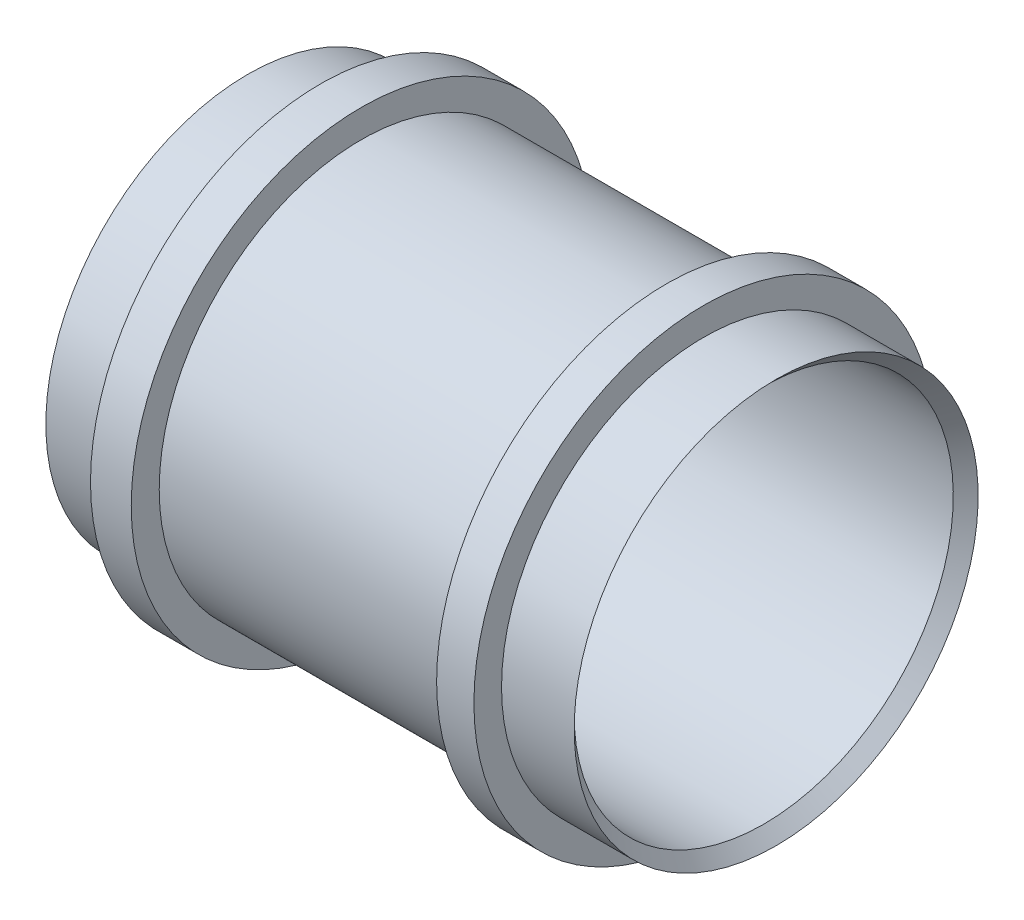
ISO-10303-21;
HEADER;
FILE_DESCRIPTION(('STEP AP214'),'2;1');
FILE_NAME('part.step','',(''),(''),'','','');
FILE_SCHEMA(('AUTOMOTIVE_DESIGN { 1 0 10303 214 1 1 1 1 }'));
ENDSEC;
DATA;
#1=APPLICATION_CONTEXT('core data for automotive mechanical design processes');
#2=APPLICATION_PROTOCOL_DEFINITION('international standard','automotive_design',2000,#1);
#3=PRODUCT_CONTEXT('',#1,'mechanical');
#4=PRODUCT('Part','Part','',(#3));
#5=PRODUCT_RELATED_PRODUCT_CATEGORY('part','',(#4));
#6=PRODUCT_DEFINITION_FORMATION('','',#4);
#7=PRODUCT_DEFINITION_CONTEXT('part definition',#1,'design');
#8=PRODUCT_DEFINITION('design','',#6,#7);
#9=PRODUCT_DEFINITION_SHAPE('','',#8);
#10=(LENGTH_UNIT() NAMED_UNIT(*) SI_UNIT(.MILLI.,.METRE.));
#11=(NAMED_UNIT(*) PLANE_ANGLE_UNIT() SI_UNIT($,.RADIAN.));
#12=(NAMED_UNIT(*) SI_UNIT($,.STERADIAN.) SOLID_ANGLE_UNIT());
#13=UNCERTAINTY_MEASURE_WITH_UNIT(LENGTH_MEASURE(1.E-05),#10,'distance_accuracy_value','');
#14=(GEOMETRIC_REPRESENTATION_CONTEXT(3) GLOBAL_UNCERTAINTY_ASSIGNED_CONTEXT((#13)) GLOBAL_UNIT_ASSIGNED_CONTEXT((#10,
#11,#12)) REPRESENTATION_CONTEXT('',''));
#15=CARTESIAN_POINT('',(0.,0.,0.));
#16=DIRECTION('',(0.,0.,1.));
#17=DIRECTION('',(1.,0.,0.));
#18=AXIS2_PLACEMENT_3D('',#15,#16,#17);
#19=CARTESIAN_POINT('',(-117.087033782433,0.,0.));
#20=DIRECTION('',(-1.,0.,0.));
#21=DIRECTION('',(0.,-1.,0.));
#22=AXIS2_PLACEMENT_3D('',#19,#20,#21);
#23=CYLINDRICAL_SURFACE('',#22,65.);
#24=CARTESIAN_POINT('',(52.9129662175668,0.,0.));
#25=DIRECTION('',(-1.,0.,0.));
#26=DIRECTION('',(0.,-1.,0.));
#27=AXIS2_PLACEMENT_3D('',#24,#25,#26);
#28=CIRCLE('',#27,65.);
#29=CARTESIAN_POINT('',(52.9129662175668,-65.,0.));
#30=VERTEX_POINT('',#29);
#31=EDGE_CURVE('E63',#30,#30,#28,.T.);
#32=ORIENTED_EDGE('',*,*,#31,.T.);
#33=EDGE_LOOP('',(#32));
#34=FACE_BOUND('',#33,.T.);
#35=CARTESIAN_POINT('',(29.5449662175668,0.,0.));
#36=DIRECTION('',(-1.,0.,0.));
#37=DIRECTION('',(0.,0.,1.));
#38=AXIS2_PLACEMENT_3D('',#35,#36,#37);
#39=CIRCLE('',#38,65.);
#40=CARTESIAN_POINT('',(29.5449662175668,0.,65.));
#41=VERTEX_POINT('',#40);
#42=EDGE_CURVE('E84',#41,#41,#39,.T.);
#43=ORIENTED_EDGE('',*,*,#42,.F.);
#44=EDGE_LOOP('',(#43));
#45=FACE_BOUND('',#44,.T.);
#46=ADVANCED_FACE('F43',(#34,#45),#23,.T.);
#47=CARTESIAN_POINT('',(-80.6062599202455,0.,0.));
#48=DIRECTION('',(1.,0.,0.));
#49=DIRECTION('',(0.,0.,-1.));
#50=AXIS2_PLACEMENT_3D('',#47,#48,#49);
#51=CIRCLE('',#50,65.);
#52=CARTESIAN_POINT('',(-80.6062599202455,0.,-65.));
#53=VERTEX_POINT('',#52);
#54=EDGE_CURVE('E50',#53,#53,#51,.F.);
#55=ORIENTED_EDGE('',*,*,#54,.F.);
#56=EDGE_LOOP('',(#55));
#57=FACE_BOUND('',#56,.T.);
#58=CARTESIAN_POINT('',(17.5449662175668,0.,0.));
#59=DIRECTION('',(-1.,0.,0.));
#60=DIRECTION('',(0.,0.,1.));
#61=AXIS2_PLACEMENT_3D('',#58,#59,#60);
#62=CIRCLE('',#61,65.);
#63=CARTESIAN_POINT('',(17.5449662175668,0.,65.));
#64=VERTEX_POINT('',#63);
#65=EDGE_CURVE('E81',#64,#64,#62,.T.);
#66=ORIENTED_EDGE('',*,*,#65,.T.);
#67=EDGE_LOOP('',(#66));
#68=FACE_BOUND('',#67,.T.);
#69=ADVANCED_FACE('F91',(#57,#68),#23,.T.);
#70=CARTESIAN_POINT('',(-93.7190337824332,0.,0.));
#71=DIRECTION('',(-1.,0.,0.));
#72=DIRECTION('',(0.,0.,1.));
#73=AXIS2_PLACEMENT_3D('',#70,#71,#72);
#74=CIRCLE('',#73,65.);
#75=CARTESIAN_POINT('',(-93.7190337824332,0.,65.));
#76=VERTEX_POINT('',#75);
#77=EDGE_CURVE('E10',#76,#76,#74,.F.);
#78=ORIENTED_EDGE('',*,*,#77,.F.);
#79=EDGE_LOOP('',(#78));
#80=FACE_BOUND('',#79,.T.);
#81=CARTESIAN_POINT('',(-117.087033782433,0.,0.));
#82=DIRECTION('',(-1.,0.,0.));
#83=DIRECTION('',(0.,-1.,0.));
#84=AXIS2_PLACEMENT_3D('',#81,#82,#83);
#85=CIRCLE('',#84,65.);
#86=CARTESIAN_POINT('',(-117.087033782433,-65.,0.));
#87=VERTEX_POINT('',#86);
#88=EDGE_CURVE('E66',#87,#87,#85,.T.);
#89=ORIENTED_EDGE('',*,*,#88,.F.);
#90=EDGE_LOOP('',(#89));
#91=FACE_BOUND('',#90,.T.);
#92=ADVANCED_FACE('F94',(#80,#91),#23,.T.);
#93=CARTESIAN_POINT('',(-117.087033782433,0.,0.));
#94=DIRECTION('',(-1.,0.,0.));
#95=DIRECTION('',(0.,-1.,0.));
#96=AXIS2_PLACEMENT_3D('',#93,#94,#95);
#97=CONICAL_SURFACE('',#96,65.,0.785398163397434);
#98=CARTESIAN_POINT('',(-113.087033782433,0.,0.));
#99=DIRECTION('',(-1.,0.,0.));
#100=DIRECTION('',(0.,-1.,0.));
#101=AXIS2_PLACEMENT_3D('',#98,#99,#100);
#102=CIRCLE('',#101,61.);
#103=CARTESIAN_POINT('',(-113.087033782433,-61.,0.));
#104=VERTEX_POINT('',#103);
#105=EDGE_CURVE('E54',#104,#104,#102,.T.);
#106=ORIENTED_EDGE('',*,*,#105,.F.);
#107=EDGE_LOOP('',(#106));
#108=FACE_BOUND('',#107,.T.);
#109=ORIENTED_EDGE('',*,*,#88,.T.);
#110=EDGE_LOOP('',(#109));
#111=FACE_BOUND('',#110,.T.);
#112=ADVANCED_FACE('F45',(#108,#111),#97,.F.);
#113=CARTESIAN_POINT('',(-117.087033782433,0.,0.));
#114=DIRECTION('',(-1.,0.,0.));
#115=DIRECTION('',(0.,-1.,0.));
#116=AXIS2_PLACEMENT_3D('',#113,#114,#115);
#117=CYLINDRICAL_SURFACE('',#116,61.);
#118=CARTESIAN_POINT('',(48.9129662175668,0.,0.));
#119=DIRECTION('',(-1.,0.,0.));
#120=DIRECTION('',(0.,-1.,0.));
#121=AXIS2_PLACEMENT_3D('',#118,#119,#120);
#122=CIRCLE('',#121,61.);
#123=CARTESIAN_POINT('',(48.9129662175668,-61.,0.));
#124=VERTEX_POINT('',#123);
#125=EDGE_CURVE('E58',#124,#124,#122,.T.);
#126=ORIENTED_EDGE('',*,*,#125,.F.);
#127=EDGE_LOOP('',(#126));
#128=FACE_BOUND('',#127,.T.);
#129=ORIENTED_EDGE('',*,*,#105,.T.);
#130=EDGE_LOOP('',(#129));
#131=FACE_BOUND('',#130,.T.);
#132=ADVANCED_FACE('F109',(#128,#131),#117,.F.);
#133=CARTESIAN_POINT('',(52.9129662175668,0.,0.));
#134=DIRECTION('',(1.,0.,0.));
#135=DIRECTION('',(0.,1.,0.));
#136=AXIS2_PLACEMENT_3D('',#133,#134,#135);
#137=CONICAL_SURFACE('',#136,65.,0.785398163397447);
#138=ORIENTED_EDGE('',*,*,#125,.T.);
#139=EDGE_LOOP('',(#138));
#140=FACE_BOUND('',#139,.T.);
#141=ORIENTED_EDGE('',*,*,#31,.F.);
#142=EDGE_LOOP('',(#141));
#143=FACE_BOUND('',#142,.T.);
#144=ADVANCED_FACE('F117',(#140,#143),#137,.F.);
#145=CARTESIAN_POINT('',(-93.7190337824332,0.,0.));
#146=DIRECTION('',(-1.,0.,0.));
#147=DIRECTION('',(0.,0.,1.));
#148=AXIS2_PLACEMENT_3D('',#145,#146,#147);
#149=PLANE('',#148);
#150=CARTESIAN_POINT('',(-93.7190337824332,0.,0.));
#151=DIRECTION('',(-1.,0.,0.));
#152=DIRECTION('',(0.,0.,1.));
#153=AXIS2_PLACEMENT_3D('',#150,#151,#152);
#154=CIRCLE('',#153,74.);
#155=CARTESIAN_POINT('',(-93.7190337824332,0.,74.));
#156=VERTEX_POINT('',#155);
#157=EDGE_CURVE('E72',#156,#156,#154,.T.);
#158=ORIENTED_EDGE('',*,*,#157,.T.);
#159=EDGE_LOOP('',(#158));
#160=FACE_BOUND('',#159,.T.);
#161=ORIENTED_EDGE('',*,*,#77,.T.);
#162=EDGE_LOOP('',(#161));
#163=FACE_BOUND('',#162,.T.);
#164=ADVANCED_FACE('F123',(#160,#163),#149,.T.);
#165=CARTESIAN_POINT('',(-80.6062599202455,0.,0.));
#166=DIRECTION('',(1.,0.,0.));
#167=DIRECTION('',(0.,0.,-1.));
#168=AXIS2_PLACEMENT_3D('',#165,#166,#167);
#169=PLANE('',#168);
#170=ORIENTED_EDGE('',*,*,#54,.T.);
#171=EDGE_LOOP('',(#170));
#172=FACE_BOUND('',#171,.T.);
#173=CARTESIAN_POINT('',(-80.6062599202455,0.,0.));
#174=DIRECTION('',(-1.,0.,0.));
#175=DIRECTION('',(0.,0.,1.));
#176=AXIS2_PLACEMENT_3D('',#173,#174,#175);
#177=CIRCLE('',#176,74.);
#178=CARTESIAN_POINT('',(-80.6062599202455,0.,74.));
#179=VERTEX_POINT('',#178);
#180=EDGE_CURVE('E69',#179,#179,#177,.T.);
#181=ORIENTED_EDGE('',*,*,#180,.F.);
#182=EDGE_LOOP('',(#181));
#183=FACE_BOUND('',#182,.T.);
#184=ADVANCED_FACE('F130',(#172,#183),#169,.T.);
#185=CARTESIAN_POINT('',(-161.549470518297,0.,0.));
#186=DIRECTION('',(-1.,0.,0.));
#187=DIRECTION('',(0.,0.,1.));
#188=AXIS2_PLACEMENT_3D('',#185,#186,#187);
#189=CYLINDRICAL_SURFACE('',#188,74.);
#190=ORIENTED_EDGE('',*,*,#180,.T.);
#191=EDGE_LOOP('',(#190));
#192=FACE_BOUND('',#191,.T.);
#193=ORIENTED_EDGE('',*,*,#157,.F.);
#194=EDGE_LOOP('',(#193));
#195=FACE_BOUND('',#194,.T.);
#196=ADVANCED_FACE('F135',(#192,#195),#189,.T.);
#197=CARTESIAN_POINT('',(29.5449662175668,65.,0.));
#198=DIRECTION('',(-1.,0.,0.));
#199=DIRECTION('',(0.,0.,1.));
#200=AXIS2_PLACEMENT_3D('',#197,#198,#199);
#201=PLANE('',#200);
#202=CARTESIAN_POINT('',(29.5449662175668,0.,0.));
#203=DIRECTION('',(-1.,0.,0.));
#204=DIRECTION('',(0.,0.,1.));
#205=AXIS2_PLACEMENT_3D('',#202,#203,#204);
#206=CIRCLE('',#205,73.89);
#207=CARTESIAN_POINT('',(29.5449662175668,0.,73.89));
#208=VERTEX_POINT('',#207);
#209=EDGE_CURVE('E75',#208,#208,#206,.T.);
#210=ORIENTED_EDGE('',*,*,#209,.F.);
#211=EDGE_LOOP('',(#210));
#212=FACE_BOUND('',#211,.T.);
#213=ORIENTED_EDGE('',*,*,#42,.T.);
#214=EDGE_LOOP('',(#213));
#215=FACE_BOUND('',#214,.T.);
#216=ADVANCED_FACE('F88',(#212,#215),#201,.F.);
#217=CARTESIAN_POINT('',(-147.745174043402,0.,0.));
#218=DIRECTION('',(-1.,0.,0.));
#219=DIRECTION('',(0.,0.,1.));
#220=AXIS2_PLACEMENT_3D('',#217,#218,#219);
#221=CYLINDRICAL_SURFACE('',#220,73.89);
#222=CARTESIAN_POINT('',(17.5449662175668,0.,0.));
#223=DIRECTION('',(-1.,0.,0.));
#224=DIRECTION('',(0.,0.,1.));
#225=AXIS2_PLACEMENT_3D('',#222,#223,#224);
#226=CIRCLE('',#225,73.89);
#227=CARTESIAN_POINT('',(17.5449662175668,0.,73.89));
#228=VERTEX_POINT('',#227);
#229=EDGE_CURVE('E78',#228,#228,#226,.T.);
#230=ORIENTED_EDGE('',*,*,#229,.F.);
#231=EDGE_LOOP('',(#230));
#232=FACE_BOUND('',#231,.T.);
#233=ORIENTED_EDGE('',*,*,#209,.T.);
#234=EDGE_LOOP('',(#233));
#235=FACE_BOUND('',#234,.T.);
#236=ADVANCED_FACE('F142',(#232,#235),#221,.T.);
#237=CARTESIAN_POINT('',(17.5449662175668,73.89,0.));
#238=DIRECTION('',(1.,0.,0.));
#239=DIRECTION('',(0.,0.,-1.));
#240=AXIS2_PLACEMENT_3D('',#237,#238,#239);
#241=PLANE('',#240);
#242=ORIENTED_EDGE('',*,*,#65,.F.);
#243=EDGE_LOOP('',(#242));
#244=FACE_BOUND('',#243,.T.);
#245=ORIENTED_EDGE('',*,*,#229,.T.);
#246=EDGE_LOOP('',(#245));
#247=FACE_BOUND('',#246,.T.);
#248=ADVANCED_FACE('F146',(#244,#247),#241,.F.);
#249=CLOSED_SHELL('',(#46,#69,#92,#112,#132,#144,#164,#184,#196,#216,#236,#248));
#250=MANIFOLD_SOLID_BREP('B2',#249);
#251=ADVANCED_BREP_SHAPE_REPRESENTATION('',(#18,#250),#14);
#252=SHAPE_DEFINITION_REPRESENTATION(#9,#251);
ENDSEC;
END-ISO-10303-21;
